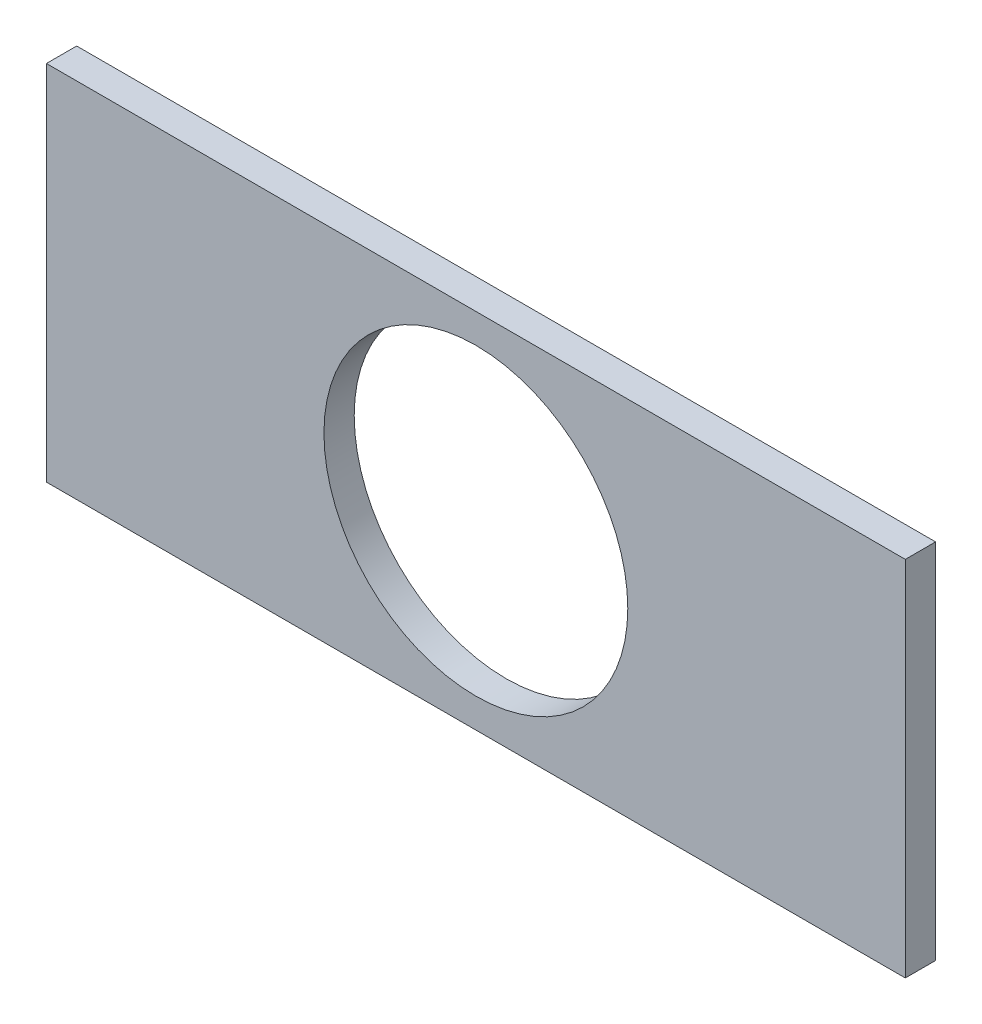
ISO-10303-21;
HEADER;
FILE_DESCRIPTION(('STEP AP214'),'2;1');
FILE_NAME('part.step','',(''),(''),'','','');
FILE_SCHEMA(('AUTOMOTIVE_DESIGN { 1 0 10303 214 1 1 1 1 }'));
ENDSEC;
DATA;
#1=APPLICATION_CONTEXT('core data for automotive mechanical design processes');
#2=APPLICATION_PROTOCOL_DEFINITION('international standard','automotive_design',2000,#1);
#3=PRODUCT_CONTEXT('',#1,'mechanical');
#4=PRODUCT('Part','Part','',(#3));
#5=PRODUCT_RELATED_PRODUCT_CATEGORY('part','',(#4));
#6=PRODUCT_DEFINITION_FORMATION('','',#4);
#7=PRODUCT_DEFINITION_CONTEXT('part definition',#1,'design');
#8=PRODUCT_DEFINITION('design','',#6,#7);
#9=PRODUCT_DEFINITION_SHAPE('','',#8);
#10=(LENGTH_UNIT() NAMED_UNIT(*) SI_UNIT(.MILLI.,.METRE.));
#11=(NAMED_UNIT(*) PLANE_ANGLE_UNIT() SI_UNIT($,.RADIAN.));
#12=(NAMED_UNIT(*) SI_UNIT($,.STERADIAN.) SOLID_ANGLE_UNIT());
#13=UNCERTAINTY_MEASURE_WITH_UNIT(LENGTH_MEASURE(1.E-05),#10,'distance_accuracy_value','');
#14=(GEOMETRIC_REPRESENTATION_CONTEXT(3) GLOBAL_UNCERTAINTY_ASSIGNED_CONTEXT((#13)) GLOBAL_UNIT_ASSIGNED_CONTEXT((#10,
#11,#12)) REPRESENTATION_CONTEXT('',''));
#15=CARTESIAN_POINT('',(0.,0.,0.));
#16=DIRECTION('',(0.,0.,1.));
#17=DIRECTION('',(1.,0.,0.));
#18=AXIS2_PLACEMENT_3D('',#15,#16,#17);
#19=CARTESIAN_POINT('',(0.,0.,6.35));
#20=DIRECTION('',(1.,0.,0.));
#21=DIRECTION('',(0.,0.,-1.));
#22=AXIS2_PLACEMENT_3D('',#19,#20,#21);
#23=PLANE('',#22);
#24=DIRECTION('',(0.,-1.,0.));
#25=VECTOR('',#24,1.);
#26=CARTESIAN_POINT('',(0.,0.,0.));
#27=LINE('',#26,#25);
#28=CARTESIAN_POINT('',(0.,76.073,0.));
#29=VERTEX_POINT('',#28);
#30=CARTESIAN_POINT('',(0.,0.,0.));
#31=VERTEX_POINT('',#30);
#32=EDGE_CURVE('E96',#29,#31,#27,.T.);
#33=ORIENTED_EDGE('',*,*,#32,.T.);
#34=DIRECTION('',(0.,0.,-1.));
#35=VECTOR('',#34,1.);
#36=CARTESIAN_POINT('',(0.,0.,6.35));
#37=LINE('',#36,#35);
#38=CARTESIAN_POINT('',(0.,0.,6.35));
#39=VERTEX_POINT('',#38);
#40=EDGE_CURVE('E11',#39,#31,#37,.T.);
#41=ORIENTED_EDGE('',*,*,#40,.F.);
#42=DIRECTION('',(0.,-1.,0.));
#43=VECTOR('',#42,1.);
#44=CARTESIAN_POINT('',(0.,0.,6.35));
#45=LINE('',#44,#43);
#46=CARTESIAN_POINT('',(0.,76.073,6.35));
#47=VERTEX_POINT('',#46);
#48=EDGE_CURVE('E84',#47,#39,#45,.T.);
#49=ORIENTED_EDGE('',*,*,#48,.F.);
#50=DIRECTION('',(0.,0.,-1.));
#51=VECTOR('',#50,1.);
#52=CARTESIAN_POINT('',(0.,76.073,6.35));
#53=LINE('',#52,#51);
#54=EDGE_CURVE('E92',#47,#29,#53,.T.);
#55=ORIENTED_EDGE('',*,*,#54,.T.);
#56=EDGE_LOOP('',(#33,#41,#49,#55));
#57=FACE_BOUND('',#56,.T.);
#58=ADVANCED_FACE('F33',(#57),#23,.F.);
#59=CARTESIAN_POINT('',(0.,0.,6.35));
#60=DIRECTION('',(0.,1.,0.));
#61=DIRECTION('',(0.,0.,1.));
#62=AXIS2_PLACEMENT_3D('',#59,#60,#61);
#63=PLANE('',#62);
#64=DIRECTION('',(1.,0.,0.));
#65=VECTOR('',#64,1.);
#66=CARTESIAN_POINT('',(0.,0.,0.));
#67=LINE('',#66,#65);
#68=CARTESIAN_POINT('',(180.213,0.,0.));
#69=VERTEX_POINT('',#68);
#70=EDGE_CURVE('E88',#31,#69,#67,.T.);
#71=ORIENTED_EDGE('',*,*,#70,.T.);
#72=DIRECTION('',(0.,0.,-1.));
#73=VECTOR('',#72,1.);
#74=CARTESIAN_POINT('',(180.213,0.,6.35));
#75=LINE('',#74,#73);
#76=CARTESIAN_POINT('',(180.213,0.,6.35));
#77=VERTEX_POINT('',#76);
#78=EDGE_CURVE('E41',#77,#69,#75,.T.);
#79=ORIENTED_EDGE('',*,*,#78,.F.);
#80=DIRECTION('',(1.,0.,0.));
#81=VECTOR('',#80,1.);
#82=CARTESIAN_POINT('',(0.,0.,6.35));
#83=LINE('',#82,#81);
#84=EDGE_CURVE('E79',#39,#77,#83,.T.);
#85=ORIENTED_EDGE('',*,*,#84,.F.);
#86=ORIENTED_EDGE('',*,*,#40,.T.);
#87=EDGE_LOOP('',(#71,#79,#85,#86));
#88=FACE_BOUND('',#87,.T.);
#89=ADVANCED_FACE('F87',(#88),#63,.F.);
#90=CARTESIAN_POINT('',(180.213,0.,6.35));
#91=DIRECTION('',(-1.,0.,0.));
#92=DIRECTION('',(0.,-1.,0.));
#93=AXIS2_PLACEMENT_3D('',#90,#91,#92);
#94=PLANE('',#93);
#95=DIRECTION('',(0.,1.,0.));
#96=VECTOR('',#95,1.);
#97=CARTESIAN_POINT('',(180.213,0.,0.));
#98=LINE('',#97,#96);
#99=CARTESIAN_POINT('',(180.213,76.073,0.));
#100=VERTEX_POINT('',#99);
#101=EDGE_CURVE('E66',#69,#100,#98,.T.);
#102=ORIENTED_EDGE('',*,*,#101,.T.);
#103=DIRECTION('',(0.,0.,-1.));
#104=VECTOR('',#103,1.);
#105=CARTESIAN_POINT('',(180.213,76.073,6.35));
#106=LINE('',#105,#104);
#107=CARTESIAN_POINT('',(180.213,76.073,6.35));
#108=VERTEX_POINT('',#107);
#109=EDGE_CURVE('E89',#108,#100,#106,.T.);
#110=ORIENTED_EDGE('',*,*,#109,.F.);
#111=DIRECTION('',(0.,1.,0.));
#112=VECTOR('',#111,1.);
#113=CARTESIAN_POINT('',(180.213,0.,6.35));
#114=LINE('',#113,#112);
#115=EDGE_CURVE('E82',#77,#108,#114,.T.);
#116=ORIENTED_EDGE('',*,*,#115,.F.);
#117=ORIENTED_EDGE('',*,*,#78,.T.);
#118=EDGE_LOOP('',(#102,#110,#116,#117));
#119=FACE_BOUND('',#118,.T.);
#120=ADVANCED_FACE('F90',(#119),#94,.F.);
#121=CARTESIAN_POINT('',(0.,76.073,6.35));
#122=DIRECTION('',(0.,-1.,0.));
#123=DIRECTION('',(0.,0.,-1.));
#124=AXIS2_PLACEMENT_3D('',#121,#122,#123);
#125=PLANE('',#124);
#126=DIRECTION('',(-1.,0.,0.));
#127=VECTOR('',#126,1.);
#128=CARTESIAN_POINT('',(0.,76.073,0.));
#129=LINE('',#128,#127);
#130=EDGE_CURVE('E72',#100,#29,#129,.T.);
#131=ORIENTED_EDGE('',*,*,#130,.T.);
#132=ORIENTED_EDGE('',*,*,#54,.F.);
#133=DIRECTION('',(-1.,0.,0.));
#134=VECTOR('',#133,1.);
#135=CARTESIAN_POINT('',(0.,76.073,6.35));
#136=LINE('',#135,#134);
#137=EDGE_CURVE('E49',#108,#47,#136,.T.);
#138=ORIENTED_EDGE('',*,*,#137,.F.);
#139=ORIENTED_EDGE('',*,*,#109,.T.);
#140=EDGE_LOOP('',(#131,#132,#138,#139));
#141=FACE_BOUND('',#140,.T.);
#142=ADVANCED_FACE('F104',(#141),#125,.F.);
#143=CARTESIAN_POINT('',(0.,0.,6.35));
#144=DIRECTION('',(0.,0.,-1.));
#145=DIRECTION('',(-1.,0.,0.));
#146=AXIS2_PLACEMENT_3D('',#143,#144,#145);
#147=PLANE('',#146);
#148=CARTESIAN_POINT('',(90.1065,38.0365,6.35));
#149=DIRECTION('',(0.,0.,1.));
#150=DIRECTION('',(1.,0.,0.));
#151=AXIS2_PLACEMENT_3D('',#148,#149,#150);
#152=CIRCLE('',#151,31.877);
#153=CARTESIAN_POINT('',(121.9835,38.0365,6.35));
#154=VERTEX_POINT('',#153);
#155=EDGE_CURVE('E110',#154,#154,#152,.T.);
#156=ORIENTED_EDGE('',*,*,#155,.F.);
#157=EDGE_LOOP('',(#156));
#158=FACE_BOUND('',#157,.T.);
#159=ORIENTED_EDGE('',*,*,#48,.T.);
#160=ORIENTED_EDGE('',*,*,#84,.T.);
#161=ORIENTED_EDGE('',*,*,#115,.T.);
#162=ORIENTED_EDGE('',*,*,#137,.T.);
#163=EDGE_LOOP('',(#159,#160,#161,#162));
#164=FACE_BOUND('',#163,.T.);
#165=ADVANCED_FACE('F80',(#158,#164),#147,.F.);
#166=CARTESIAN_POINT('',(0.,0.,0.));
#167=DIRECTION('',(0.,0.,-1.));
#168=DIRECTION('',(-1.,0.,0.));
#169=AXIS2_PLACEMENT_3D('',#166,#167,#168);
#170=PLANE('',#169);
#171=CARTESIAN_POINT('',(90.1065,38.0365,0.));
#172=DIRECTION('',(0.,0.,1.));
#173=DIRECTION('',(1.,0.,0.));
#174=AXIS2_PLACEMENT_3D('',#171,#172,#173);
#175=CIRCLE('',#174,31.877);
#176=CARTESIAN_POINT('',(121.9835,38.0365,0.));
#177=VERTEX_POINT('',#176);
#178=EDGE_CURVE('E99',#177,#177,#175,.T.);
#179=ORIENTED_EDGE('',*,*,#178,.T.);
#180=EDGE_LOOP('',(#179));
#181=FACE_BOUND('',#180,.T.);
#182=ORIENTED_EDGE('',*,*,#32,.F.);
#183=ORIENTED_EDGE('',*,*,#130,.F.);
#184=ORIENTED_EDGE('',*,*,#101,.F.);
#185=ORIENTED_EDGE('',*,*,#70,.F.);
#186=EDGE_LOOP('',(#182,#183,#184,#185));
#187=FACE_BOUND('',#186,.T.);
#188=ADVANCED_FACE('F107',(#181,#187),#170,.T.);
#189=CARTESIAN_POINT('',(90.1065,38.0365,0.));
#190=DIRECTION('',(0.,0.,1.));
#191=DIRECTION('',(1.,0.,0.));
#192=AXIS2_PLACEMENT_3D('',#189,#190,#191);
#193=CYLINDRICAL_SURFACE('',#192,31.877);
#194=ORIENTED_EDGE('',*,*,#178,.F.);
#195=EDGE_LOOP('',(#194));
#196=FACE_BOUND('',#195,.T.);
#197=ORIENTED_EDGE('',*,*,#155,.T.);
#198=EDGE_LOOP('',(#197));
#199=FACE_BOUND('',#198,.T.);
#200=ADVANCED_FACE('F117',(#196,#199),#193,.F.);
#201=CLOSED_SHELL('',(#58,#89,#120,#142,#165,#188,#200));
#202=MANIFOLD_SOLID_BREP('B2',#201);
#203=ADVANCED_BREP_SHAPE_REPRESENTATION('',(#18,#202),#14);
#204=SHAPE_DEFINITION_REPRESENTATION(#9,#203);
ENDSEC;
END-ISO-10303-21;
